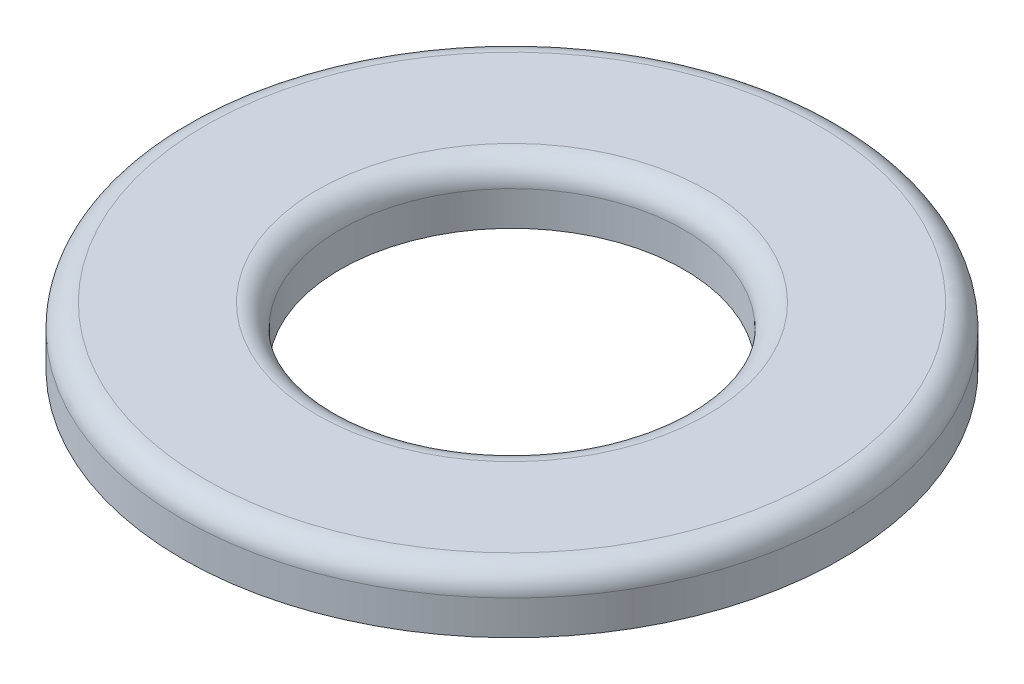
ISO-10303-21;
HEADER;
FILE_DESCRIPTION(('STEP AP214'),'2;1');
FILE_NAME('part.step','',(''),(''),'','','');
FILE_SCHEMA(('AUTOMOTIVE_DESIGN { 1 0 10303 214 1 1 1 1 }'));
ENDSEC;
DATA;
#1=APPLICATION_CONTEXT('core data for automotive mechanical design processes');
#2=APPLICATION_PROTOCOL_DEFINITION('international standard','automotive_design',2000,#1);
#3=PRODUCT_CONTEXT('',#1,'mechanical');
#4=PRODUCT('Part','Part','',(#3));
#5=PRODUCT_RELATED_PRODUCT_CATEGORY('part','',(#4));
#6=PRODUCT_DEFINITION_FORMATION('','',#4);
#7=PRODUCT_DEFINITION_CONTEXT('part definition',#1,'design');
#8=PRODUCT_DEFINITION('design','',#6,#7);
#9=PRODUCT_DEFINITION_SHAPE('','',#8);
#10=(LENGTH_UNIT() NAMED_UNIT(*) SI_UNIT(.MILLI.,.METRE.));
#11=(NAMED_UNIT(*) PLANE_ANGLE_UNIT() SI_UNIT($,.RADIAN.));
#12=(NAMED_UNIT(*) SI_UNIT($,.STERADIAN.) SOLID_ANGLE_UNIT());
#13=UNCERTAINTY_MEASURE_WITH_UNIT(LENGTH_MEASURE(1.E-05),#10,'distance_accuracy_value','');
#14=(GEOMETRIC_REPRESENTATION_CONTEXT(3) GLOBAL_UNCERTAINTY_ASSIGNED_CONTEXT((#13)) GLOBAL_UNIT_ASSIGNED_CONTEXT((#10,
#11,#12)) REPRESENTATION_CONTEXT('',''));
#15=CARTESIAN_POINT('',(0.,0.,0.));
#16=DIRECTION('',(0.,0.,1.));
#17=DIRECTION('',(1.,0.,0.));
#18=AXIS2_PLACEMENT_3D('',#15,#16,#17);
#19=CARTESIAN_POINT('',(0.,0.5,0.));
#20=DIRECTION('',(0.,1.,0.));
#21=DIRECTION('',(0.,0.,1.));
#22=AXIS2_PLACEMENT_3D('',#19,#20,#21);
#23=PLANE('',#22);
#24=CARTESIAN_POINT('',(0.,0.5,0.));
#25=DIRECTION('',(0.,1.,0.));
#26=DIRECTION('',(0.,0.,1.));
#27=AXIS2_PLACEMENT_3D('',#24,#25,#26);
#28=CIRCLE('',#27,1.7);
#29=CARTESIAN_POINT('',(0.,0.5,1.7));
#30=VERTEX_POINT('',#29);
#31=EDGE_CURVE('E42',#30,#30,#28,.F.);
#32=ORIENTED_EDGE('',*,*,#31,.T.);
#33=EDGE_LOOP('',(#32));
#34=FACE_BOUND('',#33,.T.);
#35=CARTESIAN_POINT('',(0.,0.5,0.));
#36=DIRECTION('',(0.,1.,0.));
#37=DIRECTION('',(0.,0.,1.));
#38=AXIS2_PLACEMENT_3D('',#35,#36,#37);
#39=CIRCLE('',#38,2.675);
#40=CARTESIAN_POINT('',(0.,0.5,2.675));
#41=VERTEX_POINT('',#40);
#42=EDGE_CURVE('E46',#41,#41,#39,.T.);
#43=ORIENTED_EDGE('',*,*,#42,.T.);
#44=EDGE_LOOP('',(#43));
#45=FACE_BOUND('',#44,.T.);
#46=ADVANCED_FACE('F35',(#34,#45),#23,.T.);
#47=CARTESIAN_POINT('',(0.,0.,0.));
#48=DIRECTION('',(0.,1.,0.));
#49=DIRECTION('',(0.,0.,1.));
#50=AXIS2_PLACEMENT_3D('',#47,#48,#49);
#51=PLANE('',#50);
#52=CARTESIAN_POINT('',(0.,0.,0.));
#53=DIRECTION('',(0.,1.,0.));
#54=DIRECTION('',(0.,0.,1.));
#55=AXIS2_PLACEMENT_3D('',#52,#53,#54);
#56=CIRCLE('',#55,2.875);
#57=CARTESIAN_POINT('',(0.,0.,2.875));
#58=VERTEX_POINT('',#57);
#59=EDGE_CURVE('E55',#58,#58,#56,.T.);
#60=ORIENTED_EDGE('',*,*,#59,.F.);
#61=EDGE_LOOP('',(#60));
#62=FACE_BOUND('',#61,.T.);
#63=CARTESIAN_POINT('',(0.,0.,0.));
#64=DIRECTION('',(0.,1.,0.));
#65=DIRECTION('',(0.,0.,1.));
#66=AXIS2_PLACEMENT_3D('',#63,#64,#65);
#67=CIRCLE('',#66,1.5);
#68=CARTESIAN_POINT('',(0.,0.,1.5));
#69=VERTEX_POINT('',#68);
#70=EDGE_CURVE('E58',#69,#69,#67,.T.);
#71=ORIENTED_EDGE('',*,*,#70,.T.);
#72=EDGE_LOOP('',(#71));
#73=FACE_BOUND('',#72,.T.);
#74=ADVANCED_FACE('F62',(#62,#73),#51,.F.);
#75=CARTESIAN_POINT('',(0.,0.5,0.));
#76=DIRECTION('',(0.,-1.,0.));
#77=DIRECTION('',(0.,0.,-1.));
#78=AXIS2_PLACEMENT_3D('',#75,#76,#77);
#79=CYLINDRICAL_SURFACE('',#78,2.875);
#80=CARTESIAN_POINT('',(0.,0.3,0.));
#81=DIRECTION('',(0.,1.,0.));
#82=DIRECTION('',(0.,0.,1.));
#83=AXIS2_PLACEMENT_3D('',#80,#81,#82);
#84=CIRCLE('',#83,2.875);
#85=CARTESIAN_POINT('',(0.,0.3,2.875));
#86=VERTEX_POINT('',#85);
#87=EDGE_CURVE('E10',#86,#86,#84,.F.);
#88=ORIENTED_EDGE('',*,*,#87,.T.);
#89=EDGE_LOOP('',(#88));
#90=FACE_BOUND('',#89,.T.);
#91=ORIENTED_EDGE('',*,*,#59,.T.);
#92=EDGE_LOOP('',(#91));
#93=FACE_BOUND('',#92,.T.);
#94=ADVANCED_FACE('F67',(#90,#93),#79,.T.);
#95=CARTESIAN_POINT('',(0.,0.5,0.));
#96=DIRECTION('',(0.,-1.,0.));
#97=DIRECTION('',(0.,0.,-1.));
#98=AXIS2_PLACEMENT_3D('',#95,#96,#97);
#99=CYLINDRICAL_SURFACE('',#98,1.5);
#100=CARTESIAN_POINT('',(0.,0.3,0.));
#101=DIRECTION('',(0.,1.,0.));
#102=DIRECTION('',(0.,0.,1.));
#103=AXIS2_PLACEMENT_3D('',#100,#101,#102);
#104=CIRCLE('',#103,1.5);
#105=CARTESIAN_POINT('',(0.,0.3,1.5));
#106=VERTEX_POINT('',#105);
#107=EDGE_CURVE('E50',#106,#106,#104,.T.);
#108=ORIENTED_EDGE('',*,*,#107,.T.);
#109=EDGE_LOOP('',(#108));
#110=FACE_BOUND('',#109,.T.);
#111=ORIENTED_EDGE('',*,*,#70,.F.);
#112=EDGE_LOOP('',(#111));
#113=FACE_BOUND('',#112,.T.);
#114=ADVANCED_FACE('F64',(#110,#113),#99,.F.);
#115=CARTESIAN_POINT('',(0.,0.3,0.));
#116=DIRECTION('',(0.,1.,0.));
#117=DIRECTION('',(0.,0.,1.));
#118=AXIS2_PLACEMENT_3D('',#115,#116,#117);
#119=TOROIDAL_SURFACE('',#118,1.7,0.2);
#120=ORIENTED_EDGE('',*,*,#31,.F.);
#121=EDGE_LOOP('',(#120));
#122=FACE_BOUND('',#121,.T.);
#123=ORIENTED_EDGE('',*,*,#107,.F.);
#124=EDGE_LOOP('',(#123));
#125=FACE_BOUND('',#124,.T.);
#126=ADVANCED_FACE('F66',(#122,#125),#119,.T.);
#127=CARTESIAN_POINT('',(0.,0.3,0.));
#128=DIRECTION('',(0.,1.,0.));
#129=DIRECTION('',(0.,0.,1.));
#130=AXIS2_PLACEMENT_3D('',#127,#128,#129);
#131=TOROIDAL_SURFACE('',#130,2.675,0.2);
#132=ORIENTED_EDGE('',*,*,#87,.F.);
#133=EDGE_LOOP('',(#132));
#134=FACE_BOUND('',#133,.T.);
#135=ORIENTED_EDGE('',*,*,#42,.F.);
#136=EDGE_LOOP('',(#135));
#137=FACE_BOUND('',#136,.T.);
#138=ADVANCED_FACE('F37',(#134,#137),#131,.T.);
#139=CLOSED_SHELL('',(#46,#74,#94,#114,#126,#138));
#140=MANIFOLD_SOLID_BREP('B2',#139);
#141=ADVANCED_BREP_SHAPE_REPRESENTATION('',(#18,#140),#14);
#142=SHAPE_DEFINITION_REPRESENTATION(#9,#141);
ENDSEC;
END-ISO-10303-21;
